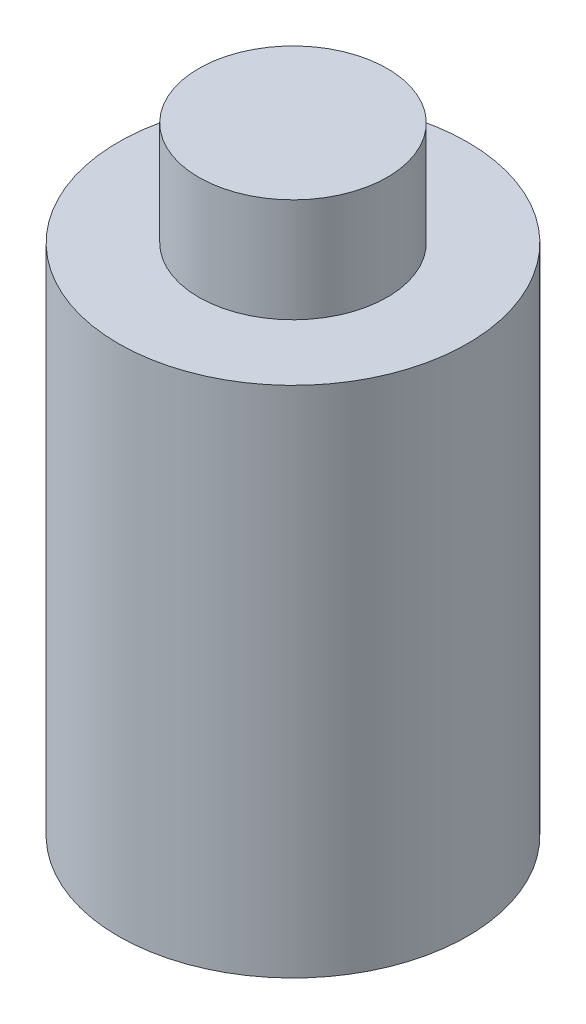
ISO-10303-21;
HEADER;
FILE_DESCRIPTION(('STEP AP214'),'2;1');
FILE_NAME('part.step','',(''),(''),'','','');
FILE_SCHEMA(('AUTOMOTIVE_DESIGN { 1 0 10303 214 1 1 1 1 }'));
ENDSEC;
DATA;
#1=APPLICATION_CONTEXT('core data for automotive mechanical design processes');
#2=APPLICATION_PROTOCOL_DEFINITION('international standard','automotive_design',2000,#1);
#3=PRODUCT_CONTEXT('',#1,'mechanical');
#4=PRODUCT('Part','Part','',(#3));
#5=PRODUCT_RELATED_PRODUCT_CATEGORY('part','',(#4));
#6=PRODUCT_DEFINITION_FORMATION('','',#4);
#7=PRODUCT_DEFINITION_CONTEXT('part definition',#1,'design');
#8=PRODUCT_DEFINITION('design','',#6,#7);
#9=PRODUCT_DEFINITION_SHAPE('','',#8);
#10=(LENGTH_UNIT() NAMED_UNIT(*) SI_UNIT(.MILLI.,.METRE.));
#11=(NAMED_UNIT(*) PLANE_ANGLE_UNIT() SI_UNIT($,.RADIAN.));
#12=(NAMED_UNIT(*) SI_UNIT($,.STERADIAN.) SOLID_ANGLE_UNIT());
#13=UNCERTAINTY_MEASURE_WITH_UNIT(LENGTH_MEASURE(1.E-05),#10,'distance_accuracy_value','');
#14=(GEOMETRIC_REPRESENTATION_CONTEXT(3) GLOBAL_UNCERTAINTY_ASSIGNED_CONTEXT((#13)) GLOBAL_UNIT_ASSIGNED_CONTEXT((#10,
#11,#12)) REPRESENTATION_CONTEXT('',''));
#15=CARTESIAN_POINT('',(0.,0.,0.));
#16=DIRECTION('',(0.,0.,1.));
#17=DIRECTION('',(1.,0.,0.));
#18=AXIS2_PLACEMENT_3D('',#15,#16,#17);
#19=CARTESIAN_POINT('',(0.,14.7,0.));
#20=DIRECTION('',(0.,1.,0.));
#21=DIRECTION('',(0.,0.,1.));
#22=AXIS2_PLACEMENT_3D('',#19,#20,#21);
#23=PLANE('',#22);
#24=CARTESIAN_POINT('',(0.,14.7,0.));
#25=DIRECTION('',(0.,1.,0.));
#26=DIRECTION('',(0.,0.,1.));
#27=AXIS2_PLACEMENT_3D('',#24,#25,#26);
#28=CIRCLE('',#27,5.);
#29=CARTESIAN_POINT('',(0.,14.7,5.));
#30=VERTEX_POINT('',#29);
#31=EDGE_CURVE('E10',#30,#30,#28,.T.);
#32=ORIENTED_EDGE('',*,*,#31,.T.);
#33=EDGE_LOOP('',(#32));
#34=FACE_BOUND('',#33,.T.);
#35=CARTESIAN_POINT('',(0.,14.7,0.));
#36=DIRECTION('',(0.,1.,0.));
#37=DIRECTION('',(0.,0.,1.));
#38=AXIS2_PLACEMENT_3D('',#35,#36,#37);
#39=CIRCLE('',#38,2.7);
#40=CARTESIAN_POINT('',(0.,14.7,2.7));
#41=VERTEX_POINT('',#40);
#42=EDGE_CURVE('E44',#41,#41,#39,.T.);
#43=ORIENTED_EDGE('',*,*,#42,.F.);
#44=EDGE_LOOP('',(#43));
#45=FACE_BOUND('',#44,.T.);
#46=ADVANCED_FACE('F33',(#34,#45),#23,.T.);
#47=CARTESIAN_POINT('',(0.,0.,0.));
#48=DIRECTION('',(0.,1.,0.));
#49=DIRECTION('',(0.,0.,1.));
#50=AXIS2_PLACEMENT_3D('',#47,#48,#49);
#51=PLANE('',#50);
#52=CARTESIAN_POINT('',(0.,0.,0.));
#53=DIRECTION('',(0.,1.,0.));
#54=DIRECTION('',(0.,0.,1.));
#55=AXIS2_PLACEMENT_3D('',#52,#53,#54);
#56=CIRCLE('',#55,5.);
#57=CARTESIAN_POINT('',(0.,0.,5.));
#58=VERTEX_POINT('',#57);
#59=EDGE_CURVE('E37',#58,#58,#56,.T.);
#60=ORIENTED_EDGE('',*,*,#59,.F.);
#61=EDGE_LOOP('',(#60));
#62=FACE_BOUND('',#61,.T.);
#63=ADVANCED_FACE('F63',(#62),#51,.F.);
#64=CARTESIAN_POINT('',(0.,14.7,0.));
#65=DIRECTION('',(0.,-1.,0.));
#66=DIRECTION('',(0.,0.,-1.));
#67=AXIS2_PLACEMENT_3D('',#64,#65,#66);
#68=CYLINDRICAL_SURFACE('',#67,5.);
#69=ORIENTED_EDGE('',*,*,#31,.F.);
#70=EDGE_LOOP('',(#69));
#71=FACE_BOUND('',#70,.T.);
#72=ORIENTED_EDGE('',*,*,#59,.T.);
#73=EDGE_LOOP('',(#72));
#74=FACE_BOUND('',#73,.T.);
#75=ADVANCED_FACE('F35',(#71,#74),#68,.T.);
#76=CARTESIAN_POINT('',(0.,17.675,0.));
#77=DIRECTION('',(0.,-1.,0.));
#78=DIRECTION('',(0.,0.,-1.));
#79=AXIS2_PLACEMENT_3D('',#76,#77,#78);
#80=CYLINDRICAL_SURFACE('',#79,2.7);
#81=ORIENTED_EDGE('',*,*,#42,.T.);
#82=EDGE_LOOP('',(#81));
#83=FACE_BOUND('',#82,.T.);
#84=CARTESIAN_POINT('',(0.,17.675,0.));
#85=DIRECTION('',(0.,1.,0.));
#86=DIRECTION('',(0.,0.,1.));
#87=AXIS2_PLACEMENT_3D('',#84,#85,#86);
#88=CIRCLE('',#87,2.7);
#89=CARTESIAN_POINT('',(0.,17.675,2.7));
#90=VERTEX_POINT('',#89);
#91=EDGE_CURVE('E48',#90,#90,#88,.T.);
#92=ORIENTED_EDGE('',*,*,#91,.F.);
#93=EDGE_LOOP('',(#92));
#94=FACE_BOUND('',#93,.T.);
#95=ADVANCED_FACE('F54',(#83,#94),#80,.T.);
#96=CARTESIAN_POINT('',(0.,17.675,0.));
#97=DIRECTION('',(0.,1.,0.));
#98=DIRECTION('',(0.,0.,1.));
#99=AXIS2_PLACEMENT_3D('',#96,#97,#98);
#100=PLANE('',#99);
#101=ORIENTED_EDGE('',*,*,#91,.T.);
#102=EDGE_LOOP('',(#101));
#103=FACE_BOUND('',#102,.T.);
#104=ADVANCED_FACE('F52',(#103),#100,.T.);
#105=CLOSED_SHELL('',(#46,#63,#75,#95,#104));
#106=MANIFOLD_SOLID_BREP('B2',#105);
#107=ADVANCED_BREP_SHAPE_REPRESENTATION('',(#18,#106),#14);
#108=SHAPE_DEFINITION_REPRESENTATION(#9,#107);
ENDSEC;
END-ISO-10303-21;
